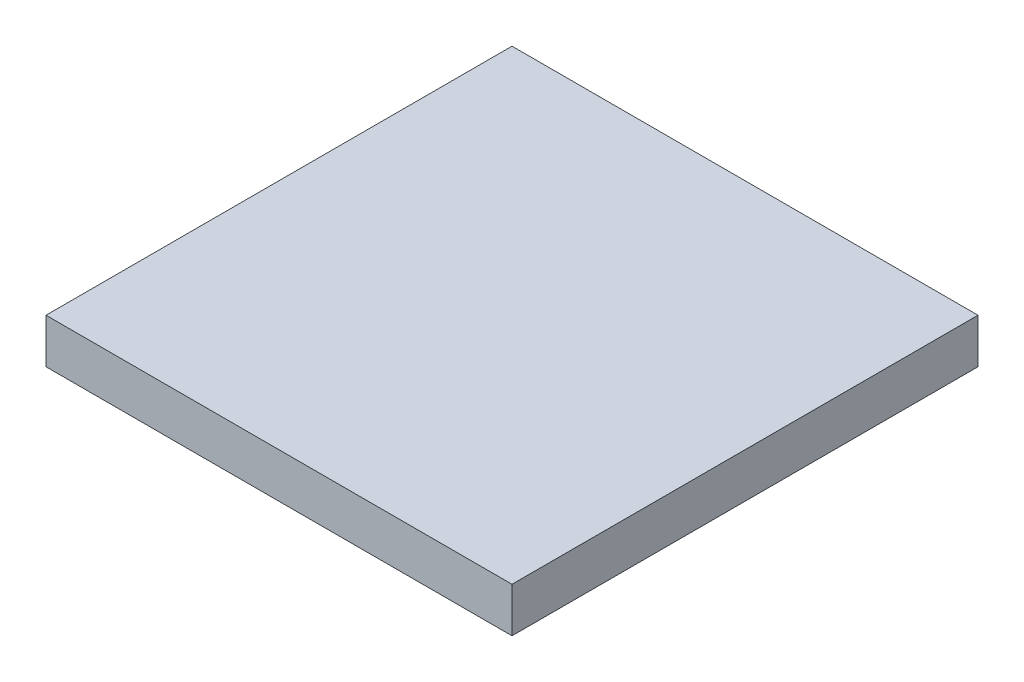
ISO-10303-21;
HEADER;
FILE_DESCRIPTION(('STEP AP214'),'2;1');
FILE_NAME('part.step','',(''),(''),'','','');
FILE_SCHEMA(('AUTOMOTIVE_DESIGN { 1 0 10303 214 1 1 1 1 }'));
ENDSEC;
DATA;
#1=APPLICATION_CONTEXT('core data for automotive mechanical design processes');
#2=APPLICATION_PROTOCOL_DEFINITION('international standard','automotive_design',2000,#1);
#3=PRODUCT_CONTEXT('',#1,'mechanical');
#4=PRODUCT('Part','Part','',(#3));
#5=PRODUCT_RELATED_PRODUCT_CATEGORY('part','',(#4));
#6=PRODUCT_DEFINITION_FORMATION('','',#4);
#7=PRODUCT_DEFINITION_CONTEXT('part definition',#1,'design');
#8=PRODUCT_DEFINITION('design','',#6,#7);
#9=PRODUCT_DEFINITION_SHAPE('','',#8);
#10=(LENGTH_UNIT() NAMED_UNIT(*) SI_UNIT(.MILLI.,.METRE.));
#11=(NAMED_UNIT(*) PLANE_ANGLE_UNIT() SI_UNIT($,.RADIAN.));
#12=(NAMED_UNIT(*) SI_UNIT($,.STERADIAN.) SOLID_ANGLE_UNIT());
#13=UNCERTAINTY_MEASURE_WITH_UNIT(LENGTH_MEASURE(1.E-05),#10,'distance_accuracy_value','');
#14=(GEOMETRIC_REPRESENTATION_CONTEXT(3) GLOBAL_UNCERTAINTY_ASSIGNED_CONTEXT((#13)) GLOBAL_UNIT_ASSIGNED_CONTEXT((#10,
#11,#12)) REPRESENTATION_CONTEXT('',''));
#15=CARTESIAN_POINT('',(0.,0.,0.));
#16=DIRECTION('',(0.,0.,1.));
#17=DIRECTION('',(1.,0.,0.));
#18=AXIS2_PLACEMENT_3D('',#15,#16,#17);
#19=CARTESIAN_POINT('',(95.25,18.25625,-95.25));
#20=DIRECTION('',(-1.,0.,0.));
#21=DIRECTION('',(0.,0.,1.));
#22=AXIS2_PLACEMENT_3D('',#19,#20,#21);
#23=PLANE('',#22);
#24=DIRECTION('',(0.,0.,-1.));
#25=VECTOR('',#24,1.);
#26=CARTESIAN_POINT('',(95.25,0.,-95.25));
#27=LINE('',#26,#25);
#28=CARTESIAN_POINT('',(95.25,0.,95.25));
#29=VERTEX_POINT('',#28);
#30=CARTESIAN_POINT('',(95.25,0.,-95.25));
#31=VERTEX_POINT('',#30);
#32=EDGE_CURVE('E96',#29,#31,#27,.T.);
#33=ORIENTED_EDGE('',*,*,#32,.T.);
#34=DIRECTION('',(0.,-1.,0.));
#35=VECTOR('',#34,1.);
#36=CARTESIAN_POINT('',(95.25,18.25625,-95.25));
#37=LINE('',#36,#35);
#38=CARTESIAN_POINT('',(95.25,18.25625,-95.25));
#39=VERTEX_POINT('',#38);
#40=EDGE_CURVE('E11',#39,#31,#37,.T.);
#41=ORIENTED_EDGE('',*,*,#40,.F.);
#42=DIRECTION('',(0.,0.,-1.));
#43=VECTOR('',#42,1.);
#44=CARTESIAN_POINT('',(95.25,18.25625,-95.25));
#45=LINE('',#44,#43);
#46=CARTESIAN_POINT('',(95.25,18.25625,95.25));
#47=VERTEX_POINT('',#46);
#48=EDGE_CURVE('E84',#47,#39,#45,.T.);
#49=ORIENTED_EDGE('',*,*,#48,.F.);
#50=DIRECTION('',(0.,-1.,0.));
#51=VECTOR('',#50,1.);
#52=CARTESIAN_POINT('',(95.25,18.25625,95.25));
#53=LINE('',#52,#51);
#54=EDGE_CURVE('E92',#47,#29,#53,.T.);
#55=ORIENTED_EDGE('',*,*,#54,.T.);
#56=EDGE_LOOP('',(#33,#41,#49,#55));
#57=FACE_BOUND('',#56,.T.);
#58=ADVANCED_FACE('F33',(#57),#23,.F.);
#59=CARTESIAN_POINT('',(-95.25,18.25625,-95.25));
#60=DIRECTION('',(0.,0.,1.));
#61=DIRECTION('',(1.,0.,0.));
#62=AXIS2_PLACEMENT_3D('',#59,#60,#61);
#63=PLANE('',#62);
#64=DIRECTION('',(-1.,0.,0.));
#65=VECTOR('',#64,1.);
#66=CARTESIAN_POINT('',(-95.25,0.,-95.25));
#67=LINE('',#66,#65);
#68=CARTESIAN_POINT('',(-95.25,0.,-95.25));
#69=VERTEX_POINT('',#68);
#70=EDGE_CURVE('E88',#31,#69,#67,.T.);
#71=ORIENTED_EDGE('',*,*,#70,.T.);
#72=DIRECTION('',(0.,-1.,0.));
#73=VECTOR('',#72,1.);
#74=CARTESIAN_POINT('',(-95.25,18.25625,-95.25));
#75=LINE('',#74,#73);
#76=CARTESIAN_POINT('',(-95.25,18.25625,-95.25));
#77=VERTEX_POINT('',#76);
#78=EDGE_CURVE('E41',#77,#69,#75,.T.);
#79=ORIENTED_EDGE('',*,*,#78,.F.);
#80=DIRECTION('',(-1.,0.,0.));
#81=VECTOR('',#80,1.);
#82=CARTESIAN_POINT('',(-95.25,18.25625,-95.25));
#83=LINE('',#82,#81);
#84=EDGE_CURVE('E79',#39,#77,#83,.T.);
#85=ORIENTED_EDGE('',*,*,#84,.F.);
#86=ORIENTED_EDGE('',*,*,#40,.T.);
#87=EDGE_LOOP('',(#71,#79,#85,#86));
#88=FACE_BOUND('',#87,.T.);
#89=ADVANCED_FACE('F87',(#88),#63,.F.);
#90=CARTESIAN_POINT('',(-95.25,18.25625,-95.25));
#91=DIRECTION('',(1.,0.,0.));
#92=DIRECTION('',(0.,0.,-1.));
#93=AXIS2_PLACEMENT_3D('',#90,#91,#92);
#94=PLANE('',#93);
#95=DIRECTION('',(0.,0.,1.));
#96=VECTOR('',#95,1.);
#97=CARTESIAN_POINT('',(-95.25,0.,-95.25));
#98=LINE('',#97,#96);
#99=CARTESIAN_POINT('',(-95.25,0.,95.25));
#100=VERTEX_POINT('',#99);
#101=EDGE_CURVE('E66',#69,#100,#98,.T.);
#102=ORIENTED_EDGE('',*,*,#101,.T.);
#103=DIRECTION('',(0.,-1.,0.));
#104=VECTOR('',#103,1.);
#105=CARTESIAN_POINT('',(-95.25,18.25625,95.25));
#106=LINE('',#105,#104);
#107=CARTESIAN_POINT('',(-95.25,18.25625,95.25));
#108=VERTEX_POINT('',#107);
#109=EDGE_CURVE('E89',#108,#100,#106,.T.);
#110=ORIENTED_EDGE('',*,*,#109,.F.);
#111=DIRECTION('',(0.,0.,1.));
#112=VECTOR('',#111,1.);
#113=CARTESIAN_POINT('',(-95.25,18.25625,-95.25));
#114=LINE('',#113,#112);
#115=EDGE_CURVE('E82',#77,#108,#114,.T.);
#116=ORIENTED_EDGE('',*,*,#115,.F.);
#117=ORIENTED_EDGE('',*,*,#78,.T.);
#118=EDGE_LOOP('',(#102,#110,#116,#117));
#119=FACE_BOUND('',#118,.T.);
#120=ADVANCED_FACE('F90',(#119),#94,.F.);
#121=CARTESIAN_POINT('',(-95.25,18.25625,95.25));
#122=DIRECTION('',(0.,0.,-1.));
#123=DIRECTION('',(-1.,0.,0.));
#124=AXIS2_PLACEMENT_3D('',#121,#122,#123);
#125=PLANE('',#124);
#126=DIRECTION('',(1.,0.,0.));
#127=VECTOR('',#126,1.);
#128=CARTESIAN_POINT('',(-95.25,0.,95.25));
#129=LINE('',#128,#127);
#130=EDGE_CURVE('E72',#100,#29,#129,.T.);
#131=ORIENTED_EDGE('',*,*,#130,.T.);
#132=ORIENTED_EDGE('',*,*,#54,.F.);
#133=DIRECTION('',(1.,0.,0.));
#134=VECTOR('',#133,1.);
#135=CARTESIAN_POINT('',(-95.25,18.25625,95.25));
#136=LINE('',#135,#134);
#137=EDGE_CURVE('E49',#108,#47,#136,.T.);
#138=ORIENTED_EDGE('',*,*,#137,.F.);
#139=ORIENTED_EDGE('',*,*,#109,.T.);
#140=EDGE_LOOP('',(#131,#132,#138,#139));
#141=FACE_BOUND('',#140,.T.);
#142=ADVANCED_FACE('F103',(#141),#125,.F.);
#143=CARTESIAN_POINT('',(0.,18.25625,0.));
#144=DIRECTION('',(0.,1.,0.));
#145=DIRECTION('',(0.,0.,1.));
#146=AXIS2_PLACEMENT_3D('',#143,#144,#145);
#147=PLANE('',#146);
#148=ORIENTED_EDGE('',*,*,#48,.T.);
#149=ORIENTED_EDGE('',*,*,#84,.T.);
#150=ORIENTED_EDGE('',*,*,#115,.T.);
#151=ORIENTED_EDGE('',*,*,#137,.T.);
#152=EDGE_LOOP('',(#148,#149,#150,#151));
#153=FACE_BOUND('',#152,.T.);
#154=ADVANCED_FACE('F80',(#153),#147,.T.);
#155=CARTESIAN_POINT('',(0.,0.,0.));
#156=DIRECTION('',(0.,1.,0.));
#157=DIRECTION('',(0.,0.,1.));
#158=AXIS2_PLACEMENT_3D('',#155,#156,#157);
#159=PLANE('',#158);
#160=ORIENTED_EDGE('',*,*,#32,.F.);
#161=ORIENTED_EDGE('',*,*,#130,.F.);
#162=ORIENTED_EDGE('',*,*,#101,.F.);
#163=ORIENTED_EDGE('',*,*,#70,.F.);
#164=EDGE_LOOP('',(#160,#161,#162,#163));
#165=FACE_BOUND('',#164,.T.);
#166=ADVANCED_FACE('F106',(#165),#159,.F.);
#167=CLOSED_SHELL('',(#58,#89,#120,#142,#154,#166));
#168=MANIFOLD_SOLID_BREP('B2',#167);
#169=ADVANCED_BREP_SHAPE_REPRESENTATION('',(#18,#168),#14);
#170=SHAPE_DEFINITION_REPRESENTATION(#9,#169);
ENDSEC;
END-ISO-10303-21;
